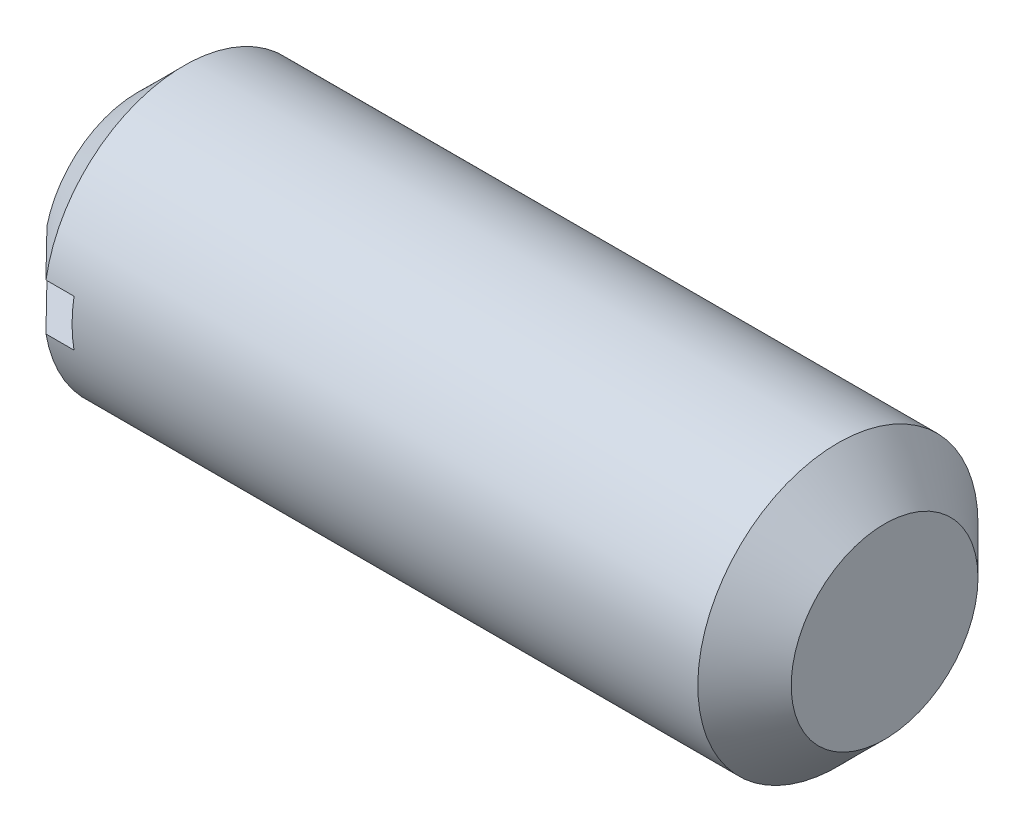
ISO-10303-21;
HEADER;
FILE_DESCRIPTION(('STEP AP214'),'2;1');
FILE_NAME('part.step','',(''),(''),'','','');
FILE_SCHEMA(('AUTOMOTIVE_DESIGN { 1 0 10303 214 1 1 1 1 }'));
ENDSEC;
DATA;
#1=APPLICATION_CONTEXT('core data for automotive mechanical design processes');
#2=APPLICATION_PROTOCOL_DEFINITION('international standard','automotive_design',2000,#1);
#3=PRODUCT_CONTEXT('',#1,'mechanical');
#4=PRODUCT('Part','Part','',(#3));
#5=PRODUCT_RELATED_PRODUCT_CATEGORY('part','',(#4));
#6=PRODUCT_DEFINITION_FORMATION('','',#4);
#7=PRODUCT_DEFINITION_CONTEXT('part definition',#1,'design');
#8=PRODUCT_DEFINITION('design','',#6,#7);
#9=PRODUCT_DEFINITION_SHAPE('','',#8);
#10=(LENGTH_UNIT() NAMED_UNIT(*) SI_UNIT(.MILLI.,.METRE.));
#11=(NAMED_UNIT(*) PLANE_ANGLE_UNIT() SI_UNIT($,.RADIAN.));
#12=(NAMED_UNIT(*) SI_UNIT($,.STERADIAN.) SOLID_ANGLE_UNIT());
#13=UNCERTAINTY_MEASURE_WITH_UNIT(LENGTH_MEASURE(1.E-05),#10,'distance_accuracy_value','');
#14=(GEOMETRIC_REPRESENTATION_CONTEXT(3) GLOBAL_UNCERTAINTY_ASSIGNED_CONTEXT((#13)) GLOBAL_UNIT_ASSIGNED_CONTEXT((#10,
#11,#12)) REPRESENTATION_CONTEXT('',''));
#15=CARTESIAN_POINT('',(0.,0.,0.));
#16=DIRECTION('',(0.,0.,1.));
#17=DIRECTION('',(1.,0.,0.));
#18=AXIS2_PLACEMENT_3D('',#15,#16,#17);
#19=CARTESIAN_POINT('',(0.,0.,0.));
#20=DIRECTION('',(1.,0.,0.));
#21=DIRECTION('',(0.,0.,-1.));
#22=AXIS2_PLACEMENT_3D('',#19,#20,#21);
#23=PLANE('',#22);
#24=DIRECTION('',(0.,0.,1.));
#25=VECTOR('',#24,1.);
#26=CARTESIAN_POINT('',(0.,0.5,0.));
#27=LINE('',#26,#25);
#28=CARTESIAN_POINT('',(0.,0.5,-1.93649167310371));
#29=VERTEX_POINT('',#28);
#30=CARTESIAN_POINT('',(0.,0.5,1.93649167310371));
#31=VERTEX_POINT('',#30);
#32=EDGE_CURVE('E123',#29,#31,#27,.T.);
#33=ORIENTED_EDGE('',*,*,#32,.T.);
#34=CARTESIAN_POINT('',(0.,0.,0.));
#35=DIRECTION('',(1.,0.,0.));
#36=DIRECTION('',(0.,0.,-1.));
#37=AXIS2_PLACEMENT_3D('',#34,#35,#36);
#38=CIRCLE('',#37,2.);
#39=EDGE_CURVE('E177',#31,#29,#38,.F.);
#40=ORIENTED_EDGE('',*,*,#39,.T.);
#41=EDGE_LOOP('',(#33,#40));
#42=FACE_BOUND('',#41,.T.);
#43=ADVANCED_FACE('F38',(#42),#23,.F.);
#44=CARTESIAN_POINT('',(16.,0.,0.));
#45=DIRECTION('',(-1.,0.,0.));
#46=DIRECTION('',(0.,0.,1.));
#47=AXIS2_PLACEMENT_3D('',#44,#45,#46);
#48=CYLINDRICAL_SURFACE('',#47,3.);
#49=CARTESIAN_POINT('',(15.,0.,0.));
#50=DIRECTION('',(1.,0.,0.));
#51=DIRECTION('',(0.,0.,-1.));
#52=AXIS2_PLACEMENT_3D('',#49,#50,#51);
#53=CIRCLE('',#52,3.);
#54=CARTESIAN_POINT('',(15.,0.,-3.));
#55=VERTEX_POINT('',#54);
#56=EDGE_CURVE('E132',#55,#55,#53,.F.);
#57=ORIENTED_EDGE('',*,*,#56,.T.);
#58=EDGE_LOOP('',(#57));
#59=FACE_BOUND('',#58,.T.);
#60=DIRECTION('',(-1.,0.,0.));
#61=VECTOR('',#60,1.);
#62=CARTESIAN_POINT('',(16.,0.5,-2.95803989154981));
#63=LINE('',#62,#61);
#64=CARTESIAN_POINT('',(1.6,0.5,-2.95803989154981));
#65=VERTEX_POINT('',#64);
#66=CARTESIAN_POINT('',(1.,0.5,-2.95803989154981));
#67=VERTEX_POINT('',#66);
#68=EDGE_CURVE('E119',#65,#67,#63,.T.);
#69=ORIENTED_EDGE('',*,*,#68,.T.);
#70=CARTESIAN_POINT('',(1.,0.,0.));
#71=DIRECTION('',(1.,0.,0.));
#72=DIRECTION('',(0.,0.,-1.));
#73=AXIS2_PLACEMENT_3D('',#70,#71,#72);
#74=CIRCLE('',#73,3.);
#75=CARTESIAN_POINT('',(1.,0.5,2.95803989154981));
#76=VERTEX_POINT('',#75);
#77=EDGE_CURVE('E129',#67,#76,#74,.T.);
#78=ORIENTED_EDGE('',*,*,#77,.T.);
#79=DIRECTION('',(-1.,0.,0.));
#80=VECTOR('',#79,1.);
#81=CARTESIAN_POINT('',(16.,0.5,2.95803989154981));
#82=LINE('',#81,#80);
#83=CARTESIAN_POINT('',(1.6,0.5,2.95803989154981));
#84=VERTEX_POINT('',#83);
#85=EDGE_CURVE('E117',#76,#84,#82,.F.);
#86=ORIENTED_EDGE('',*,*,#85,.T.);
#87=CARTESIAN_POINT('',(1.6,0.,0.));
#88=DIRECTION('',(1.,0.,0.));
#89=DIRECTION('',(0.,1.,0.));
#90=AXIS2_PLACEMENT_3D('',#87,#88,#89);
#91=CIRCLE('',#90,3.);
#92=CARTESIAN_POINT('',(1.6,-0.499999999999999,2.95803989154981));
#93=VERTEX_POINT('',#92);
#94=EDGE_CURVE('E110',#84,#93,#91,.T.);
#95=ORIENTED_EDGE('',*,*,#94,.T.);
#96=DIRECTION('',(-1.,0.,0.));
#97=VECTOR('',#96,1.);
#98=CARTESIAN_POINT('',(16.,-0.499999999999993,2.95803989154981));
#99=LINE('',#98,#97);
#100=CARTESIAN_POINT('',(1.,-0.499999999999993,2.95803989154981));
#101=VERTEX_POINT('',#100);
#102=EDGE_CURVE('E98',#93,#101,#99,.T.);
#103=ORIENTED_EDGE('',*,*,#102,.T.);
#104=CARTESIAN_POINT('',(1.,0.,0.));
#105=DIRECTION('',(1.,0.,0.));
#106=DIRECTION('',(0.,0.,-1.));
#107=AXIS2_PLACEMENT_3D('',#104,#105,#106);
#108=CIRCLE('',#107,3.);
#109=CARTESIAN_POINT('',(1.,-0.499999999999993,-2.95803989154981));
#110=VERTEX_POINT('',#109);
#111=EDGE_CURVE('E96',#101,#110,#108,.T.);
#112=ORIENTED_EDGE('',*,*,#111,.T.);
#113=DIRECTION('',(-1.,0.,0.));
#114=VECTOR('',#113,1.);
#115=CARTESIAN_POINT('',(16.,-0.499999999999993,-2.95803989154981));
#116=LINE('',#115,#114);
#117=CARTESIAN_POINT('',(1.6,-0.499999999999999,-2.95803989154981));
#118=VERTEX_POINT('',#117);
#119=EDGE_CURVE('E89',#110,#118,#116,.F.);
#120=ORIENTED_EDGE('',*,*,#119,.T.);
#121=EDGE_CURVE('E93',#118,#65,#91,.T.);
#122=ORIENTED_EDGE('',*,*,#121,.T.);
#123=EDGE_LOOP('',(#69,#78,#86,#95,#103,#112,#120,#122));
#124=FACE_BOUND('',#123,.T.);
#125=ADVANCED_FACE('F92',(#59,#124),#48,.T.);
#126=CARTESIAN_POINT('',(16.,0.,0.));
#127=DIRECTION('',(1.,0.,0.));
#128=DIRECTION('',(0.,0.,-1.));
#129=AXIS2_PLACEMENT_3D('',#126,#127,#128);
#130=PLANE('',#129);
#131=CARTESIAN_POINT('',(16.,0.,0.));
#132=DIRECTION('',(1.,0.,0.));
#133=DIRECTION('',(0.,0.,-1.));
#134=AXIS2_PLACEMENT_3D('',#131,#132,#133);
#135=CIRCLE('',#134,2.);
#136=CARTESIAN_POINT('',(16.,0.,-2.));
#137=VERTEX_POINT('',#136);
#138=EDGE_CURVE('E109',#137,#137,#135,.T.);
#139=ORIENTED_EDGE('',*,*,#138,.T.);
#140=EDGE_LOOP('',(#139));
#141=FACE_BOUND('',#140,.T.);
#142=ADVANCED_FACE('F164',(#141),#130,.T.);
#143=DIRECTION('',(0.,0.,-1.));
#144=VECTOR('',#143,1.);
#145=CARTESIAN_POINT('',(0.,-0.5,0.));
#146=LINE('',#145,#144);
#147=CARTESIAN_POINT('',(0.,-0.5,1.93649167310371));
#148=VERTEX_POINT('',#147);
#149=CARTESIAN_POINT('',(0.,-0.5,-1.93649167310371));
#150=VERTEX_POINT('',#149);
#151=EDGE_CURVE('E121',#148,#150,#146,.T.);
#152=ORIENTED_EDGE('',*,*,#151,.T.);
#153=CARTESIAN_POINT('',(0.,0.,0.));
#154=DIRECTION('',(1.,0.,0.));
#155=DIRECTION('',(0.,0.,-1.));
#156=AXIS2_PLACEMENT_3D('',#153,#154,#155);
#157=CIRCLE('',#156,2.);
#158=EDGE_CURVE('E11',#150,#148,#157,.F.);
#159=ORIENTED_EDGE('',*,*,#158,.T.);
#160=EDGE_LOOP('',(#152,#159));
#161=FACE_BOUND('',#160,.T.);
#162=ADVANCED_FACE('F159',(#161),#23,.F.);
#163=CARTESIAN_POINT('',(1.6,-0.499999999999999,-3.));
#164=DIRECTION('',(1.,0.,0.));
#165=DIRECTION('',(0.,1.,0.));
#166=AXIS2_PLACEMENT_3D('',#163,#164,#165);
#167=PLANE('',#166);
#168=DIRECTION('',(0.,0.,1.));
#169=VECTOR('',#168,1.);
#170=CARTESIAN_POINT('',(1.6,0.5,-3.));
#171=LINE('',#170,#169);
#172=EDGE_CURVE('E99',#65,#84,#171,.T.);
#173=ORIENTED_EDGE('',*,*,#172,.F.);
#174=ORIENTED_EDGE('',*,*,#121,.F.);
#175=DIRECTION('',(0.,0.,1.));
#176=VECTOR('',#175,1.);
#177=CARTESIAN_POINT('',(1.6,-0.499999999999999,-3.));
#178=LINE('',#177,#176);
#179=EDGE_CURVE('E106',#118,#93,#178,.T.);
#180=ORIENTED_EDGE('',*,*,#179,.T.);
#181=ORIENTED_EDGE('',*,*,#94,.F.);
#182=EDGE_LOOP('',(#173,#174,#180,#181));
#183=FACE_BOUND('',#182,.T.);
#184=ADVANCED_FACE('F104',(#183),#167,.F.);
#185=CARTESIAN_POINT('',(0.,0.5,-3.));
#186=DIRECTION('',(0.,1.,0.));
#187=DIRECTION('',(0.,0.,1.));
#188=AXIS2_PLACEMENT_3D('',#185,#186,#187);
#189=PLANE('',#188);
#190=ORIENTED_EDGE('',*,*,#85,.F.);
#191=CARTESIAN_POINT('',(1.,0.5,2.95803989154981));
#192=CARTESIAN_POINT('',(0.916360937399621,0.5,2.87321057386063));
#193=CARTESIAN_POINT('',(0.832768676117375,0.5,2.78833502142045));
#194=CARTESIAN_POINT('',(0.665718105830664,0.5,2.61845301695997));
#195=CARTESIAN_POINT('',(0.582259796187009,0.5,2.53344656556811));
#196=CARTESIAN_POINT('',(0.415516459306036,0.5,2.3632632992279));
#197=CARTESIAN_POINT('',(0.332231432522685,0.5,2.27808648383437));
#198=CARTESIAN_POINT('',(0.165910133112893,0.5,2.10748959532065));
#199=CARTESIAN_POINT('',(0.0828738616984555,0.5,2.02206952101917));
#200=CARTESIAN_POINT('',(0.,0.5,1.93649167310371));
#201=B_SPLINE_CURVE_WITH_KNOTS('',3,(#191,#192,#193,#194,#195,#196,#197,#198,#199,#200),
.UNSPECIFIED.,.F.,.F.,(4,2,2,2,4),(0.,0.357384388361984,0.714767066254881,1.07215067924185,
1.42953603067532),.UNSPECIFIED.);
#202=EDGE_CURVE('E142',#76,#31,#201,.T.);
#203=ORIENTED_EDGE('',*,*,#202,.T.);
#204=ORIENTED_EDGE('',*,*,#32,.F.);
#205=CARTESIAN_POINT('',(0.,0.5,-1.93649167310371));
#206=CARTESIAN_POINT('',(0.0828738616984556,0.5,-2.02206952101917));
#207=CARTESIAN_POINT('',(0.165910133112893,0.5,-2.10748959532065));
#208=CARTESIAN_POINT('',(0.332231432522684,0.5,-2.27808648383437));
#209=CARTESIAN_POINT('',(0.415516459306036,0.5,-2.3632632992279));
#210=CARTESIAN_POINT('',(0.582259796187009,0.5,-2.53344656556811));
#211=CARTESIAN_POINT('',(0.665718105830664,0.5,-2.61845301695997));
#212=CARTESIAN_POINT('',(0.832768676117375,0.5,-2.78833502142045));
#213=CARTESIAN_POINT('',(0.916360937399622,0.5,-2.87321057386063));
#214=CARTESIAN_POINT('',(1.,0.5,-2.95803989154981));
#215=B_SPLINE_CURVE_WITH_KNOTS('',3,(#205,#206,#207,#208,#209,#210,#211,#212,#213,#214),
.UNSPECIFIED.,.F.,.F.,(4,2,2,2,4),(0.,0.357385351433467,0.714768964420438,1.07215164231334,
1.42953603067532),.UNSPECIFIED.);
#216=EDGE_CURVE('E135',#29,#67,#215,.T.);
#217=ORIENTED_EDGE('',*,*,#216,.T.);
#218=ORIENTED_EDGE('',*,*,#68,.F.);
#219=ORIENTED_EDGE('',*,*,#172,.T.);
#220=EDGE_LOOP('',(#190,#203,#204,#217,#218,#219));
#221=FACE_BOUND('',#220,.T.);
#222=ADVANCED_FACE('F151',(#221),#189,.F.);
#223=CARTESIAN_POINT('',(0.,-0.5,-3.));
#224=DIRECTION('',(0.,-1.,0.));
#225=DIRECTION('',(1.,0.,0.));
#226=AXIS2_PLACEMENT_3D('',#223,#224,#225);
#227=PLANE('',#226);
#228=ORIENTED_EDGE('',*,*,#119,.F.);
#229=CARTESIAN_POINT('',(1.,-0.499999999999993,-2.95803989154981));
#230=CARTESIAN_POINT('',(0.916360937399622,-0.499999999999997,-2.87321057386063));
#231=CARTESIAN_POINT('',(0.832768676117375,-0.499999999999999,-2.78833502142045));
#232=CARTESIAN_POINT('',(0.665718105830665,-0.5,-2.61845301695997));
#233=CARTESIAN_POINT('',(0.582259796187009,-0.5,-2.53344656556811));
#234=CARTESIAN_POINT('',(0.415516459306037,-0.5,-2.3632632992279));
#235=CARTESIAN_POINT('',(0.332231432522685,-0.5,-2.27808648383437));
#236=CARTESIAN_POINT('',(0.165910133112893,-0.5,-2.10748959532065));
#237=CARTESIAN_POINT('',(0.0828738616984557,-0.5,-2.02206952101917));
#238=CARTESIAN_POINT('',(0.,-0.5,-1.93649167310371));
#239=B_SPLINE_CURVE_WITH_KNOTS('',3,(#229,#230,#231,#232,#233,#234,#235,#236,#237,#238),
.UNSPECIFIED.,.F.,.F.,(4,2,2,2,4),(0.,0.357384388361984,0.714767066254882,1.07215067924185,
1.42953603067532),.UNSPECIFIED.);
#240=EDGE_CURVE('E47',#110,#150,#239,.T.);
#241=ORIENTED_EDGE('',*,*,#240,.T.);
#242=ORIENTED_EDGE('',*,*,#151,.F.);
#243=CARTESIAN_POINT('',(0.,-0.5,1.93649167310371));
#244=CARTESIAN_POINT('',(0.0828738616984556,-0.5,2.02206952101917));
#245=CARTESIAN_POINT('',(0.165910133112893,-0.5,2.10748959532065));
#246=CARTESIAN_POINT('',(0.332231432522684,-0.5,2.27808648383437));
#247=CARTESIAN_POINT('',(0.415516459306036,-0.5,2.3632632992279));
#248=CARTESIAN_POINT('',(0.582259796187009,-0.5,2.53344656556811));
#249=CARTESIAN_POINT('',(0.665718105830664,-0.5,2.61845301695997));
#250=CARTESIAN_POINT('',(0.832768676117375,-0.5,2.78833502142045));
#251=CARTESIAN_POINT('',(0.916360937399622,-0.5,2.87321057386063));
#252=CARTESIAN_POINT('',(1.,-0.5,2.95803989154981));
#253=B_SPLINE_CURVE_WITH_KNOTS('',3,(#243,#244,#245,#246,#247,#248,#249,#250,#251,#252),
.UNSPECIFIED.,.F.,.F.,(4,2,2,2,4),(0.,0.357385351433467,0.714768964420438,1.07215164231334,
1.42953603067532),.UNSPECIFIED.);
#254=EDGE_CURVE('E168',#148,#101,#253,.T.);
#255=ORIENTED_EDGE('',*,*,#254,.T.);
#256=ORIENTED_EDGE('',*,*,#102,.F.);
#257=ORIENTED_EDGE('',*,*,#179,.F.);
#258=EDGE_LOOP('',(#228,#241,#242,#255,#256,#257));
#259=FACE_BOUND('',#258,.T.);
#260=ADVANCED_FACE('F112',(#259),#227,.F.);
#261=CARTESIAN_POINT('',(16.,0.,0.));
#262=DIRECTION('',(-1.,0.,0.));
#263=DIRECTION('',(0.,0.,1.));
#264=AXIS2_PLACEMENT_3D('',#261,#262,#263);
#265=CONICAL_SURFACE('',#264,2.,0.785398163397446);
#266=ORIENTED_EDGE('',*,*,#56,.F.);
#267=EDGE_LOOP('',(#266));
#268=FACE_BOUND('',#267,.T.);
#269=ORIENTED_EDGE('',*,*,#138,.F.);
#270=EDGE_LOOP('',(#269));
#271=FACE_BOUND('',#270,.T.);
#272=ADVANCED_FACE('F163',(#268,#271),#265,.T.);
#273=CARTESIAN_POINT('',(1.,0.,0.));
#274=DIRECTION('',(1.,0.,0.));
#275=DIRECTION('',(0.,0.,-1.));
#276=AXIS2_PLACEMENT_3D('',#273,#274,#275);
#277=CONICAL_SURFACE('',#276,3.,0.785398163397449);
#278=ORIENTED_EDGE('',*,*,#216,.F.);
#279=ORIENTED_EDGE('',*,*,#39,.F.);
#280=ORIENTED_EDGE('',*,*,#202,.F.);
#281=ORIENTED_EDGE('',*,*,#77,.F.);
#282=EDGE_LOOP('',(#278,#279,#280,#281));
#283=FACE_BOUND('',#282,.T.);
#284=ADVANCED_FACE('F148',(#283),#277,.T.);
#285=CARTESIAN_POINT('',(1.,0.,0.));
#286=DIRECTION('',(1.,0.,0.));
#287=DIRECTION('',(0.,0.,-1.));
#288=AXIS2_PLACEMENT_3D('',#285,#286,#287);
#289=CONICAL_SURFACE('',#288,3.,0.785398163397449);
#290=ORIENTED_EDGE('',*,*,#254,.F.);
#291=ORIENTED_EDGE('',*,*,#158,.F.);
#292=ORIENTED_EDGE('',*,*,#240,.F.);
#293=ORIENTED_EDGE('',*,*,#111,.F.);
#294=EDGE_LOOP('',(#290,#291,#292,#293));
#295=FACE_BOUND('',#294,.T.);
#296=ADVANCED_FACE('F40',(#295),#289,.T.);
#297=CLOSED_SHELL('',(#43,#125,#142,#162,#184,#222,#260,#272,#284,#296));
#298=MANIFOLD_SOLID_BREP('B2',#297);
#299=ADVANCED_BREP_SHAPE_REPRESENTATION('',(#18,#298),#14);
#300=SHAPE_DEFINITION_REPRESENTATION(#9,#299);
ENDSEC;
END-ISO-10303-21;
